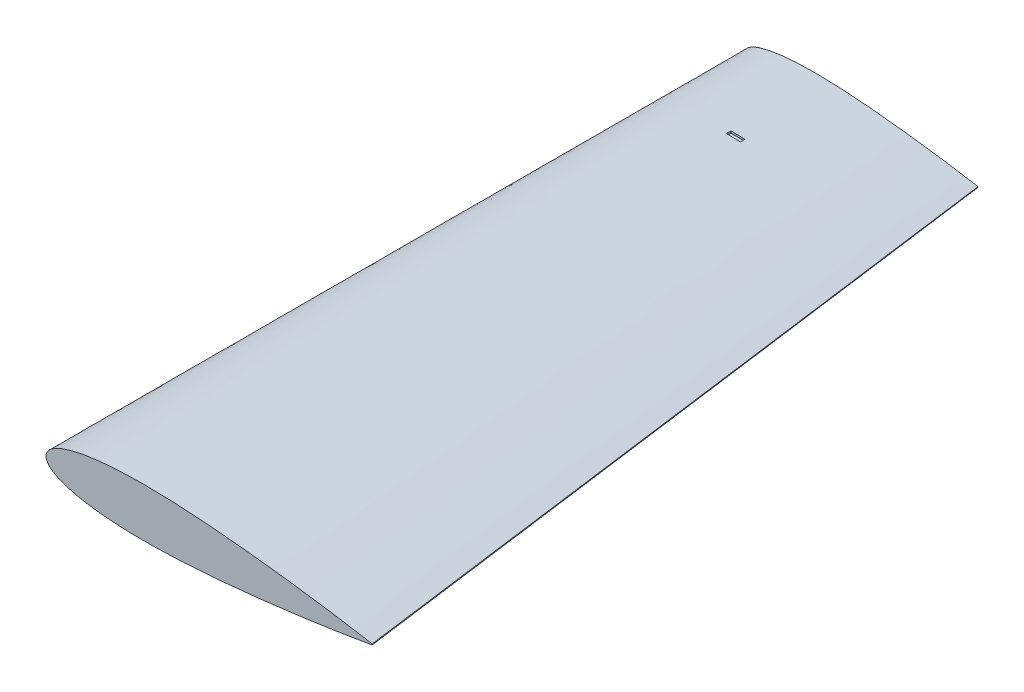
ISO-10303-21;
HEADER;
FILE_DESCRIPTION(('STEP AP214'),'2;1');
FILE_NAME('part.step','',(''),(''),'','','');
FILE_SCHEMA(('AUTOMOTIVE_DESIGN { 1 0 10303 214 1 1 1 1 }'));
ENDSEC;
DATA;
#1=APPLICATION_CONTEXT('core data for automotive mechanical design processes');
#2=APPLICATION_PROTOCOL_DEFINITION('international standard','automotive_design',2000,#1);
#3=PRODUCT_CONTEXT('',#1,'mechanical');
#4=PRODUCT('Part','Part','',(#3));
#5=PRODUCT_RELATED_PRODUCT_CATEGORY('part','',(#4));
#6=PRODUCT_DEFINITION_FORMATION('','',#4);
#7=PRODUCT_DEFINITION_CONTEXT('part definition',#1,'design');
#8=PRODUCT_DEFINITION('design','',#6,#7);
#9=PRODUCT_DEFINITION_SHAPE('','',#8);
#10=(LENGTH_UNIT() NAMED_UNIT(*) SI_UNIT(.MILLI.,.METRE.));
#11=(NAMED_UNIT(*) PLANE_ANGLE_UNIT() SI_UNIT($,.RADIAN.));
#12=(NAMED_UNIT(*) SI_UNIT($,.STERADIAN.) SOLID_ANGLE_UNIT());
#13=UNCERTAINTY_MEASURE_WITH_UNIT(LENGTH_MEASURE(1.E-05),#10,'distance_accuracy_value','');
#14=(GEOMETRIC_REPRESENTATION_CONTEXT(3) GLOBAL_UNCERTAINTY_ASSIGNED_CONTEXT((#13)) GLOBAL_UNIT_ASSIGNED_CONTEXT((#10,
#11,#12)) REPRESENTATION_CONTEXT('',''));
#15=CARTESIAN_POINT('',(0.,0.,0.));
#16=DIRECTION('',(0.,0.,1.));
#17=DIRECTION('',(1.,0.,0.));
#18=AXIS2_PLACEMENT_3D('',#15,#16,#17);
#19=CARTESIAN_POINT('',(70.,-0.1106,150.));
#20=CARTESIAN_POINT('',(50.,-0.079,0.));
#21=CARTESIAN_POINT('',(68.8337197653923,-0.311248034243055,150.));
#22=CARTESIAN_POINT('',(49.166942689566,-0.222320024459326,0.));
#23=CARTESIAN_POINT('',(66.5029583581218,-0.712234590287825,150.));
#24=CARTESIAN_POINT('',(47.5021131129441,-0.508738993062735,0.));
#25=CARTESIAN_POINT('',(61.8387019833579,-1.45769744476413,150.));
#26=CARTESIAN_POINT('',(44.1705014166842,-1.04121246054581,0.));
#27=CARTESIAN_POINT('',(56.0079453132405,-2.3134898362565,150.));
#28=CARTESIAN_POINT('',(40.0056752237432,-1.65249274018322,0.));
#29=CARTESIAN_POINT('',(49.0073591431766,-3.22523489764067,150.));
#30=CARTESIAN_POINT('',(35.0052565308404,-2.30373921260048,0.));
#31=CARTESIAN_POINT('',(42.007451256543,-4.01611555392026,150.));
#32=CARTESIAN_POINT('',(30.0053223261021,-2.86865396708589,0.));
#33=CARTESIAN_POINT('',(35.0074672180595,-4.66252154361423,150.));
#34=CARTESIAN_POINT('',(25.0053337271853,-3.33037253115302,0.));
#35=CARTESIAN_POINT('',(28.0063734198185,-5.12173570279508,150.));
#36=CARTESIAN_POINT('',(20.0045524427275,-3.65838264485363,0.));
#37=CARTESIAN_POINT('',(22.1673370094937,-5.28338672246203,150.));
#38=CARTESIAN_POINT('',(15.8338121496384,-3.77384765890145,0.));
#39=CARTESIAN_POINT('',(17.4980278952632,-5.21971676303903,150.));
#40=CARTESIAN_POINT('',(12.4985913537595,-3.72836911645645,0.));
#41=CARTESIAN_POINT('',(13.9941139705167,-5.04655717397942,150.));
#42=CARTESIAN_POINT('',(9.99579569322624,-3.60468369569959,0.));
#43=CARTESIAN_POINT('',(10.4853991903488,-4.71335698420051,150.));
#44=CARTESIAN_POINT('',(7.48957085024917,-3.36668356014322,0.));
#45=CARTESIAN_POINT('',(7.56429491491292,-4.24686419108419,150.));
#46=CARTESIAN_POINT('',(5.40306779636637,-3.03347442220299,0.));
#47=CARTESIAN_POINT('',(5.23141239456961,-3.69216703403844,150.));
#48=CARTESIAN_POINT('',(3.7367231389783,-2.63726216717032,0.));
#49=CARTESIAN_POINT('',(3.46012626155263,-3.13591504539705,150.));
#50=CARTESIAN_POINT('',(2.47151875825186,-2.23993931814074,0.));
#51=CARTESIAN_POINT('',(1.97102470716692,-2.46079902707417,150.));
#52=CARTESIAN_POINT('',(1.40787479083353,-1.75771359076727,0.));
#53=CARTESIAN_POINT('',(0.634330614674361,-1.56745643487817,150.));
#54=CARTESIAN_POINT('',(0.453093296195959,-1.11961173919868,0.));
#55=CARTESIAN_POINT('',(-0.402584956951755,0.,150.));
#56=CARTESIAN_POINT('',(-0.287560683536965,0.,0.));
#57=CARTESIAN_POINT('',(0.634330614674353,1.56745643487816,150.));
#58=CARTESIAN_POINT('',(0.453093296195967,1.11961173919869,0.));
#59=CARTESIAN_POINT('',(1.97102470716693,2.46079902707418,150.));
#60=CARTESIAN_POINT('',(1.40787479083352,1.75771359076727,0.));
#61=CARTESIAN_POINT('',(3.46012626155262,3.13591504539704,150.));
#62=CARTESIAN_POINT('',(2.47151875825187,2.23993931814074,0.));
#63=CARTESIAN_POINT('',(5.23141239456961,3.69216703403844,150.));
#64=CARTESIAN_POINT('',(3.7367231389783,2.63726216717032,0.));
#65=CARTESIAN_POINT('',(7.56429491491292,4.24686419108419,150.));
#66=CARTESIAN_POINT('',(5.40306779636637,3.03347442220299,0.));
#67=CARTESIAN_POINT('',(10.4853991903488,4.71335698420051,150.));
#68=CARTESIAN_POINT('',(7.48957085024917,3.36668356014322,0.));
#69=CARTESIAN_POINT('',(13.9941139705167,5.04655717397942,150.));
#70=CARTESIAN_POINT('',(9.99579569322624,3.60468369569959,0.));
#71=CARTESIAN_POINT('',(17.4980278952632,5.21971676303903,150.));
#72=CARTESIAN_POINT('',(12.4985913537595,3.72836911645645,0.));
#73=CARTESIAN_POINT('',(22.1673370094937,5.28338672246203,150.));
#74=CARTESIAN_POINT('',(15.8338121496384,3.77384765890145,0.));
#75=CARTESIAN_POINT('',(28.0063734198185,5.12173570279508,150.));
#76=CARTESIAN_POINT('',(20.0045524427275,3.65838264485363,0.));
#77=CARTESIAN_POINT('',(35.0074672180595,4.66252154361423,150.));
#78=CARTESIAN_POINT('',(25.0053337271853,3.33037253115302,0.));
#79=CARTESIAN_POINT('',(42.007451256543,4.01611555392026,150.));
#80=CARTESIAN_POINT('',(30.0053223261021,2.8686539670859,0.));
#81=CARTESIAN_POINT('',(49.0073591431766,3.22523489764067,150.));
#82=CARTESIAN_POINT('',(35.0052565308404,2.30373921260048,0.));
#83=CARTESIAN_POINT('',(56.0079453132405,2.3134898362565,150.));
#84=CARTESIAN_POINT('',(40.0056752237432,1.65249274018322,0.));
#85=CARTESIAN_POINT('',(61.8387019833579,1.45769744476413,150.));
#86=CARTESIAN_POINT('',(44.1705014166842,1.04121246054581,0.));
#87=CARTESIAN_POINT('',(66.5029583581218,0.712234590287827,150.));
#88=CARTESIAN_POINT('',(47.5021131129441,0.508738993062733,0.));
#89=CARTESIAN_POINT('',(68.8337197653923,0.311248034243056,150.));
#90=CARTESIAN_POINT('',(49.166942689566,0.222320024459325,0.));
#91=CARTESIAN_POINT('',(70.,0.1106,150.));
#92=CARTESIAN_POINT('',(50.,0.079,0.));
#93=B_SPLINE_SURFACE_WITH_KNOTS('',3,1,((#19,#20),(#21,#22),(#23,#24),(#25,#26),(#27,#28),(#29,
#30),(#31,#32),(#33,#34),(#35,#36),(#37,#38),(#39,#40),(#41,#42),(#43,#44),(#45,#46),(#47,#48),
(#49,#50),(#51,#52),(#53,#54),(#55,#56),(#57,#58),(#59,#60),(#61,#62),(#63,#64),(#65,#66),(#67,
#68),(#69,#70),(#71,#72),(#73,#74),(#75,#76),(#77,#78),(#79,#80),(#81,#82),(#83,#84),(#85,#86),
(#87,#88),(#89,#90),(#91,#92)),.UNSPECIFIED.,.F.,.F.,.F.,(4,1,1,1,1,1,1,1,1,1,1,1,1,1,1,1,1,1,1,
1,1,1,1,1,1,1,1,1,1,1,1,1,1,1,4),(2,2),(0.,0.0246840231451878,0.0493299696040298,
0.0985220811790584,0.147602022491555,0.196578275758491,0.245450479952565,0.294218900495614,
0.342903642198885,0.367241268256885,0.391607783764362,0.416059249203825,0.440726348791267,
0.453242725185227,0.466028386782603,0.479472724477829,0.486972137019317,0.5,0.513027862980683,
0.520527275522171,0.533971613217397,0.546757274814773,0.559273651208734,0.583940750796175,
0.608392216235638,0.632758731743115,0.657096357801115,0.705781099504386,0.754549520047436,
0.80342172424151,0.852397977508445,0.901477918820942,0.95067003039597,0.975315976854812,1.),(0.,
1.),.UNSPECIFIED.);
#94=CARTESIAN_POINT('',(17.,3.9435409575129,20.));
#95=CARTESIAN_POINT('',(17.,3.94704137872079,20.3333333333333));
#96=CARTESIAN_POINT('',(17.,3.95054179992868,20.6666666666667));
#97=CARTESIAN_POINT('',(17.,3.95404222113656,21.));
#98=B_SPLINE_CURVE_WITH_KNOTS('',3,(#94,#95,#96,#97),.UNSPECIFIED.,.F.,.F.,(4,4),(0.,
1.00005513674883),.UNSPECIFIED.);
#99=CARTESIAN_POINT('',(17.,3.9435409575129,20.));
#100=VERTEX_POINT('',#99);
#101=CARTESIAN_POINT('',(17.,3.95404222113656,21.));
#102=VERTEX_POINT('',#101);
#103=EDGE_CURVE('E247',#100,#102,#98,.T.);
#104=CARTESIAN_POINT('',(17.,3.9435409575129,20.));
#105=CARTESIAN_POINT('',(17.1667204017985,3.94150104054949,20.));
#106=CARTESIAN_POINT('',(17.3334357160651,3.93905635182317,20.));
#107=CARTESIAN_POINT('',(17.6668464236727,3.93338366271605,20.));
#108=CARTESIAN_POINT('',(17.8335418175413,3.93015569340708,20.));
#109=CARTESIAN_POINT('',(18.1669131117673,3.92294257508684,20.));
#110=CARTESIAN_POINT('',(18.3335890124256,3.91895743994164,20.));
#111=CARTESIAN_POINT('',(18.6669213943416,3.91025606132175,20.));
#112=CARTESIAN_POINT('',(18.8335778756341,3.90553981918184,20.));
#113=CARTESIAN_POINT('',(19.1668726976998,3.89540220446001,20.));
#114=CARTESIAN_POINT('',(19.33351103804,3.88998081768048,20.));
#115=CARTESIAN_POINT('',(19.6667704896104,3.87845882619122,20.));
#116=CARTESIAN_POINT('',(19.8333915999637,3.8723581960986,20.));
#117=CARTESIAN_POINT('',(20.,3.86593106788961,20.));
#118=B_SPLINE_CURVE_WITH_KNOTS('',3,(#104,#105,#106,#107,#108,#109,#110,#111,#112,#113,#114,
#115,#116,#117),.UNSPECIFIED.,.F.,.F.,(4,2,2,2,2,2,4),(0.,0.500197954692799,1.00037607035388,
1.5005450270703,2.00071307063195,2.50089118628277,3.00108799954232),.UNSPECIFIED.);
#119=CARTESIAN_POINT('',(20.,3.86593106788961,20.));
#120=VERTEX_POINT('',#119);
#121=EDGE_CURVE('E255',#100,#120,#118,.T.);
#122=CARTESIAN_POINT('',(20.,3.86593106788961,20.));
#123=CARTESIAN_POINT('',(20.,3.86984118178841,20.3333333333333));
#124=CARTESIAN_POINT('',(20.,3.87375129568721,20.6666666666667));
#125=CARTESIAN_POINT('',(20.,3.87766140958602,21.));
#126=B_SPLINE_CURVE_WITH_KNOTS('',3,(#122,#123,#124,#125),.UNSPECIFIED.,.F.,.F.,(4,4),(0.,
1.00006879809158),.UNSPECIFIED.);
#127=CARTESIAN_POINT('',(20.,3.87766140958602,21.));
#128=VERTEX_POINT('',#127);
#129=EDGE_CURVE('E219',#120,#128,#126,.T.);
#130=CARTESIAN_POINT('',(17.,3.95404222113656,21.));
#131=CARTESIAN_POINT('',(17.1667195013024,3.9520719049104,21.));
#132=CARTESIAN_POINT('',(17.3334340836188,3.9496967291327,21.));
#133=CARTESIAN_POINT('',(17.6668436388927,3.94416275567023,21.));
#134=CARTESIAN_POINT('',(17.8335386123662,3.94100398911252,21.));
#135=CARTESIAN_POINT('',(18.1669093644109,3.93392883554415,21.));
#136=CARTESIAN_POINT('',(18.3335851432781,3.93001246243342,21.));
#137=CARTESIAN_POINT('',(18.6669175687473,3.92144803713468,21.));
#138=CARTESIAN_POINT('',(18.8335742153834,3.91679998627689,21.));
#139=CARTESIAN_POINT('',(19.1668696387606,3.90679805435143,21.));
#140=CARTESIAN_POINT('',(19.3335084150736,3.90144415905343,21.));
#141=CARTESIAN_POINT('',(19.6667689943242,3.89005632208551,21.));
#142=CARTESIAN_POINT('',(19.8333907963927,3.88402235495781,21.));
#143=CARTESIAN_POINT('',(20.,3.87766140958602,21.));
#144=B_SPLINE_CURVE_WITH_KNOTS('',3,(#130,#131,#132,#133,#134,#135,#136,#137,#138,#139,#140,
#141,#142,#143),.UNSPECIFIED.,.F.,.F.,(4,2,2,2,2,2,4),(0.,0.500192743048995,1.00036561980896,
1.50052932068075,2.00069211224797,2.5008649889978,3.00105659542707),.UNSPECIFIED.);
#145=EDGE_CURVE('E211',#102,#128,#144,.T.);
#146=CARTESIAN_POINT('',(70.,0.1106,150.));
#147=CARTESIAN_POINT('',(68.8337197653923,0.311248034243056,150.));
#148=CARTESIAN_POINT('',(66.5029583581218,0.712234590287827,150.));
#149=CARTESIAN_POINT('',(61.8387019833579,1.45769744476413,150.));
#150=CARTESIAN_POINT('',(56.0079453132405,2.3134898362565,150.));
#151=CARTESIAN_POINT('',(49.0073591431766,3.22523489764067,150.));
#152=CARTESIAN_POINT('',(42.007451256543,4.01611555392026,150.));
#153=CARTESIAN_POINT('',(35.0074672180595,4.66252154361423,150.));
#154=CARTESIAN_POINT('',(28.0063734198185,5.12173570279508,150.));
#155=CARTESIAN_POINT('',(22.1673370094937,5.28338672246203,150.));
#156=CARTESIAN_POINT('',(17.4980278952632,5.21971676303903,150.));
#157=CARTESIAN_POINT('',(13.9941139705167,5.04655717397942,150.));
#158=CARTESIAN_POINT('',(10.4853991903488,4.71335698420051,150.));
#159=CARTESIAN_POINT('',(7.56429491491292,4.24686419108419,150.));
#160=CARTESIAN_POINT('',(5.23141239456961,3.69216703403844,150.));
#161=CARTESIAN_POINT('',(3.46012626155262,3.13591504539704,150.));
#162=CARTESIAN_POINT('',(1.97102470716693,2.46079902707418,150.));
#163=CARTESIAN_POINT('',(0.634330614674353,1.56745643487816,150.));
#164=CARTESIAN_POINT('',(-0.402584956951755,0.,150.));
#165=CARTESIAN_POINT('',(0.634330614674361,-1.56745643487817,150.));
#166=CARTESIAN_POINT('',(1.97102470716692,-2.46079902707417,150.));
#167=CARTESIAN_POINT('',(3.46012626155263,-3.13591504539705,150.));
#168=CARTESIAN_POINT('',(5.23141239456961,-3.69216703403844,150.));
#169=CARTESIAN_POINT('',(7.56429491491292,-4.24686419108419,150.));
#170=CARTESIAN_POINT('',(10.4853991903488,-4.71335698420051,150.));
#171=CARTESIAN_POINT('',(13.9941139705167,-5.04655717397942,150.));
#172=CARTESIAN_POINT('',(17.4980278952632,-5.21971676303903,150.));
#173=CARTESIAN_POINT('',(22.1673370094937,-5.28338672246203,150.));
#174=CARTESIAN_POINT('',(28.0063734198185,-5.12173570279508,150.));
#175=CARTESIAN_POINT('',(35.0074672180595,-4.66252154361423,150.));
#176=CARTESIAN_POINT('',(42.007451256543,-4.01611555392026,150.));
#177=CARTESIAN_POINT('',(49.0073591431766,-3.22523489764067,150.));
#178=CARTESIAN_POINT('',(56.0079453132405,-2.3134898362565,150.));
#179=CARTESIAN_POINT('',(61.8387019833579,-1.45769744476413,150.));
#180=CARTESIAN_POINT('',(66.5029583581218,-0.712234590287825,150.));
#181=CARTESIAN_POINT('',(68.8337197653923,-0.311248034243055,150.));
#182=CARTESIAN_POINT('',(70.,-0.1106,150.));
#183=B_SPLINE_CURVE_WITH_KNOTS('',3,(#146,#147,#148,#149,#150,#151,#152,#153,#154,#155,#156,
#157,#158,#159,#160,#161,#162,#163,#164,#165,#166,#167,#168,#169,#170,#171,#172,#173,#174,#175,
#176,#177,#178,#179,#180,#181,#182),.UNSPECIFIED.,.F.,.F.,(4,1,1,1,1,1,1,1,1,1,1,1,1,1,1,1,1,1,
1,1,1,1,1,1,1,1,1,1,1,1,1,1,1,1,4),(0.,0.0246840231451877,0.0493299696040297,0.0985220811790582,
0.147602022491555,0.19657827575849,0.245450479952564,0.294218900495614,0.342903642198885,
0.367241268256885,0.391607783764362,0.416059249203825,0.440726348791267,0.453242725185227,
0.466028386782603,0.479472724477829,0.486972137019317,0.5,0.513027862980683,0.520527275522171,
0.533971613217397,0.546757274814773,0.559273651208733,0.583940750796175,0.608392216235638,
0.632758731743115,0.657096357801115,0.705781099504386,0.754549520047435,0.803421724241509,
0.852397977508445,0.901477918820942,0.95067003039597,0.975315976854812,1.),.UNSPECIFIED.);
#184=CARTESIAN_POINT('',(70.,0.1106,150.));
#185=VERTEX_POINT('',#184);
#186=CARTESIAN_POINT('',(70.,-0.1106,150.));
#187=VERTEX_POINT('',#186);
#188=EDGE_CURVE('E170',#185,#187,#183,.T.);
#189=DIRECTION('',(-0.132163717209503,-0.000208818673191014,-0.99122787907127));
#190=VECTOR('',#189,1.);
#191=CARTESIAN_POINT('',(70.,0.1106,150.));
#192=LINE('',#191,#190);
#193=CARTESIAN_POINT('',(50.,0.079,0.));
#194=VERTEX_POINT('',#193);
#195=EDGE_CURVE('E193',#185,#194,#192,.T.);
#196=CARTESIAN_POINT('',(50.,0.079,0.));
#197=CARTESIAN_POINT('',(49.166942689566,0.222320024459325,0.));
#198=CARTESIAN_POINT('',(47.5021131129441,0.508738993062733,0.));
#199=CARTESIAN_POINT('',(44.1705014166842,1.04121246054581,0.));
#200=CARTESIAN_POINT('',(40.0056752237432,1.65249274018322,0.));
#201=CARTESIAN_POINT('',(35.0052565308404,2.30373921260048,0.));
#202=CARTESIAN_POINT('',(30.0053223261021,2.8686539670859,0.));
#203=CARTESIAN_POINT('',(25.0053337271853,3.33037253115302,0.));
#204=CARTESIAN_POINT('',(20.0045524427275,3.65838264485363,0.));
#205=CARTESIAN_POINT('',(15.8338121496384,3.77384765890145,0.));
#206=CARTESIAN_POINT('',(12.4985913537595,3.72836911645645,0.));
#207=CARTESIAN_POINT('',(9.99579569322624,3.60468369569959,0.));
#208=CARTESIAN_POINT('',(7.48957085024917,3.36668356014322,0.));
#209=CARTESIAN_POINT('',(5.40306779636637,3.03347442220299,0.));
#210=CARTESIAN_POINT('',(3.7367231389783,2.63726216717032,0.));
#211=CARTESIAN_POINT('',(2.47151875825187,2.23993931814074,0.));
#212=CARTESIAN_POINT('',(1.40787479083352,1.75771359076727,0.));
#213=CARTESIAN_POINT('',(0.453093296195967,1.11961173919869,0.));
#214=CARTESIAN_POINT('',(-0.287560683536965,0.,0.));
#215=CARTESIAN_POINT('',(0.453093296195959,-1.11961173919868,0.));
#216=CARTESIAN_POINT('',(1.40787479083353,-1.75771359076727,0.));
#217=CARTESIAN_POINT('',(2.47151875825186,-2.23993931814074,0.));
#218=CARTESIAN_POINT('',(3.7367231389783,-2.63726216717032,0.));
#219=CARTESIAN_POINT('',(5.40306779636637,-3.03347442220299,0.));
#220=CARTESIAN_POINT('',(7.48957085024917,-3.36668356014322,0.));
#221=CARTESIAN_POINT('',(9.99579569322624,-3.60468369569959,0.));
#222=CARTESIAN_POINT('',(12.4985913537595,-3.72836911645645,0.));
#223=CARTESIAN_POINT('',(15.8338121496384,-3.77384765890145,0.));
#224=CARTESIAN_POINT('',(20.0045524427275,-3.65838264485363,0.));
#225=CARTESIAN_POINT('',(25.0053337271853,-3.33037253115302,0.));
#226=CARTESIAN_POINT('',(30.0053223261021,-2.86865396708589,0.));
#227=CARTESIAN_POINT('',(35.0052565308404,-2.30373921260048,0.));
#228=CARTESIAN_POINT('',(40.0056752237432,-1.65249274018322,0.));
#229=CARTESIAN_POINT('',(44.1705014166842,-1.04121246054581,0.));
#230=CARTESIAN_POINT('',(47.5021131129441,-0.508738993062735,0.));
#231=CARTESIAN_POINT('',(49.166942689566,-0.222320024459326,0.));
#232=CARTESIAN_POINT('',(50.,-0.079,0.));
#233=B_SPLINE_CURVE_WITH_KNOTS('',3,(#196,#197,#198,#199,#200,#201,#202,#203,#204,#205,#206,
#207,#208,#209,#210,#211,#212,#213,#214,#215,#216,#217,#218,#219,#220,#221,#222,#223,#224,#225,
#226,#227,#228,#229,#230,#231,#232),.UNSPECIFIED.,.F.,.F.,(4,1,1,1,1,1,1,1,1,1,1,1,1,1,1,1,1,1,
1,1,1,1,1,1,1,1,1,1,1,1,1,1,1,1,4),(0.,0.0246840231451877,0.0493299696040297,0.0985220811790582,
0.147602022491555,0.19657827575849,0.245450479952564,0.294218900495614,0.342903642198885,
0.367241268256885,0.391607783764362,0.416059249203825,0.440726348791267,0.453242725185227,
0.466028386782603,0.479472724477829,0.486972137019317,0.5,0.513027862980683,0.520527275522171,
0.533971613217397,0.546757274814773,0.559273651208733,0.583940750796175,0.608392216235638,
0.632758731743115,0.657096357801115,0.705781099504386,0.754549520047436,0.803421724241509,
0.852397977508445,0.901477918820942,0.95067003039597,0.975315976854812,1.),.UNSPECIFIED.);
#234=CARTESIAN_POINT('',(50.,-0.079,0.));
#235=VERTEX_POINT('',#234);
#236=EDGE_CURVE('E196',#194,#235,#233,.T.);
#237=DIRECTION('',(-0.132163717209503,0.000208818673191014,-0.99122787907127));
#238=VECTOR('',#237,1.);
#239=CARTESIAN_POINT('',(70.,-0.1106,150.));
#240=LINE('',#239,#238);
#241=EDGE_CURVE('E192',#187,#235,#240,.T.);
#242=CARTESIAN_POINT('',(17.,-3.9435409575129,20.));
#243=CARTESIAN_POINT('',(17.1667204017985,-3.94150104054949,20.));
#244=CARTESIAN_POINT('',(17.3334357160651,-3.93905635182317,20.));
#245=CARTESIAN_POINT('',(17.6668464236726,-3.93338366271605,20.));
#246=CARTESIAN_POINT('',(17.8335418175413,-3.93015569340708,20.));
#247=CARTESIAN_POINT('',(18.1669131117673,-3.92294257508684,20.));
#248=CARTESIAN_POINT('',(18.3335890124256,-3.91895743994164,20.));
#249=CARTESIAN_POINT('',(18.6669213943416,-3.91025606132175,20.));
#250=CARTESIAN_POINT('',(18.8335778756341,-3.90553981918184,20.));
#251=CARTESIAN_POINT('',(19.1668726976998,-3.89540220446,20.));
#252=CARTESIAN_POINT('',(19.33351103804,-3.88998081768048,20.));
#253=CARTESIAN_POINT('',(19.6667704896104,-3.87845882619122,20.));
#254=CARTESIAN_POINT('',(19.8333915999637,-3.8723581960986,20.));
#255=CARTESIAN_POINT('',(20.,-3.86593106788961,20.));
#256=B_SPLINE_CURVE_WITH_KNOTS('',3,(#242,#243,#244,#245,#246,#247,#248,#249,#250,#251,#252,
#253,#254,#255),.UNSPECIFIED.,.F.,.F.,(4,2,2,2,2,2,4),(0.,0.500197954692799,1.00037607035388,
1.5005450270703,2.00071307063195,2.50089118628277,3.00108799954232),.UNSPECIFIED.);
#257=CARTESIAN_POINT('',(17.,-3.9435409575129,20.));
#258=VERTEX_POINT('',#257);
#259=CARTESIAN_POINT('',(20.,-3.86593106788961,20.));
#260=VERTEX_POINT('',#259);
#261=EDGE_CURVE('E254',#258,#260,#256,.T.);
#262=CARTESIAN_POINT('',(17.,-3.9435409575129,20.));
#263=CARTESIAN_POINT('',(17.,-3.94704137872079,20.3333333333333));
#264=CARTESIAN_POINT('',(17.,-3.95054179992867,20.6666666666667));
#265=CARTESIAN_POINT('',(17.,-3.95404222113656,21.));
#266=B_SPLINE_CURVE_WITH_KNOTS('',3,(#262,#263,#264,#265),.UNSPECIFIED.,.F.,.F.,(4,4),(0.,
1.00005513674882),.UNSPECIFIED.);
#267=CARTESIAN_POINT('',(17.,-3.95404222113656,21.));
#268=VERTEX_POINT('',#267);
#269=EDGE_CURVE('E11',#258,#268,#266,.T.);
#270=CARTESIAN_POINT('',(17.,-3.95404222113656,21.));
#271=CARTESIAN_POINT('',(17.1667195013024,-3.9520719049104,21.));
#272=CARTESIAN_POINT('',(17.3334340836188,-3.9496967291327,21.));
#273=CARTESIAN_POINT('',(17.6668436388927,-3.94416275567023,21.));
#274=CARTESIAN_POINT('',(17.8335386123662,-3.94100398911252,21.));
#275=CARTESIAN_POINT('',(18.1669093644109,-3.93392883554414,21.));
#276=CARTESIAN_POINT('',(18.3335851432781,-3.93001246243341,21.));
#277=CARTESIAN_POINT('',(18.6669175687473,-3.92144803713468,21.));
#278=CARTESIAN_POINT('',(18.8335742153834,-3.91679998627689,21.));
#279=CARTESIAN_POINT('',(19.1668696387606,-3.90679805435143,21.));
#280=CARTESIAN_POINT('',(19.3335084150736,-3.90144415905343,21.));
#281=CARTESIAN_POINT('',(19.6667689943242,-3.89005632208551,21.));
#282=CARTESIAN_POINT('',(19.8333907963927,-3.88402235495781,21.));
#283=CARTESIAN_POINT('',(20.,-3.87766140958602,21.));
#284=B_SPLINE_CURVE_WITH_KNOTS('',3,(#270,#271,#272,#273,#274,#275,#276,#277,#278,#279,#280,
#281,#282,#283),.UNSPECIFIED.,.F.,.F.,(4,2,2,2,2,2,4),(0.,0.500192743048992,1.00036561980895,
1.50052932068075,2.00069211224796,2.50086498899779,3.00105659542706),.UNSPECIFIED.);
#285=CARTESIAN_POINT('',(20.,-3.87766140958602,21.));
#286=VERTEX_POINT('',#285);
#287=EDGE_CURVE('E54',#268,#286,#284,.T.);
#288=CARTESIAN_POINT('',(20.,-3.86593106788961,20.));
#289=CARTESIAN_POINT('',(20.,-3.86984118178841,20.3333333333333));
#290=CARTESIAN_POINT('',(20.,-3.87375129568721,20.6666666666667));
#291=CARTESIAN_POINT('',(20.,-3.87766140958602,21.));
#292=B_SPLINE_CURVE_WITH_KNOTS('',3,(#288,#289,#290,#291),.UNSPECIFIED.,.F.,.F.,(4,4),(0.,
1.00006879809158),.UNSPECIFIED.);
#293=EDGE_CURVE('E267',#260,#286,#292,.T.);
#294=ORIENTED_EDGE('',*,*,#103,.F.);
#295=ORIENTED_EDGE('',*,*,#121,.T.);
#296=ORIENTED_EDGE('',*,*,#129,.T.);
#297=ORIENTED_EDGE('',*,*,#145,.F.);
#298=EDGE_LOOP('',(#294,#295,#296,#297));
#299=FACE_BOUND('',#298,.T.);
#300=ORIENTED_EDGE('',*,*,#188,.F.);
#301=ORIENTED_EDGE('',*,*,#195,.T.);
#302=ORIENTED_EDGE('',*,*,#236,.T.);
#303=ORIENTED_EDGE('',*,*,#241,.F.);
#304=EDGE_LOOP('',(#300,#301,#302,#303));
#305=FACE_BOUND('',#304,.T.);
#306=ORIENTED_EDGE('',*,*,#261,.F.);
#307=ORIENTED_EDGE('',*,*,#269,.T.);
#308=ORIENTED_EDGE('',*,*,#287,.T.);
#309=ORIENTED_EDGE('',*,*,#293,.F.);
#310=EDGE_LOOP('',(#306,#307,#308,#309));
#311=FACE_BOUND('',#310,.T.);
#312=ADVANCED_FACE('F40',(#299,#305,#311),#93,.T.);
#313=CARTESIAN_POINT('',(0.,0.,0.));
#314=DIRECTION('',(0.,0.,-1.));
#315=DIRECTION('',(-1.,0.,0.));
#316=AXIS2_PLACEMENT_3D('',#313,#314,#315);
#317=PLANE('',#316);
#318=ORIENTED_EDGE('',*,*,#236,.F.);
#319=DIRECTION('',(0.,1.,0.));
#320=VECTOR('',#319,1.);
#321=CARTESIAN_POINT('',(50.,0.079,0.));
#322=LINE('',#321,#320);
#323=EDGE_CURVE('E204',#235,#194,#322,.T.);
#324=ORIENTED_EDGE('',*,*,#323,.F.);
#325=EDGE_LOOP('',(#318,#324));
#326=FACE_BOUND('',#325,.T.);
#327=ADVANCED_FACE('F42',(#326),#317,.T.);
#328=CARTESIAN_POINT('',(0.,0.,150.));
#329=DIRECTION('',(0.,0.,-1.));
#330=DIRECTION('',(-1.,0.,0.));
#331=AXIS2_PLACEMENT_3D('',#328,#329,#330);
#332=PLANE('',#331);
#333=ORIENTED_EDGE('',*,*,#188,.T.);
#334=DIRECTION('',(0.,1.,0.));
#335=VECTOR('',#334,1.);
#336=CARTESIAN_POINT('',(70.,0.1106,150.));
#337=LINE('',#336,#335);
#338=EDGE_CURVE('E186',#187,#185,#337,.T.);
#339=ORIENTED_EDGE('',*,*,#338,.T.);
#340=EDGE_LOOP('',(#333,#339));
#341=FACE_BOUND('',#340,.T.);
#342=ADVANCED_FACE('F245',(#341),#332,.F.);
#343=CARTESIAN_POINT('',(49.1266375545852,-2.15749699903146E-12,-6.55021834061136));
#344=DIRECTION('',(0.991227900682635,0.,-0.132163720091018));
#345=DIRECTION('',(-0.132163720091018,0.,-0.991227900682635));
#346=AXIS2_PLACEMENT_3D('',#343,#344,#345);
#347=PLANE('',#346);
#348=ORIENTED_EDGE('',*,*,#241,.T.);
#349=ORIENTED_EDGE('',*,*,#323,.T.);
#350=ORIENTED_EDGE('',*,*,#195,.F.);
#351=ORIENTED_EDGE('',*,*,#338,.F.);
#352=EDGE_LOOP('',(#348,#349,#350,#351));
#353=FACE_BOUND('',#352,.T.);
#354=ADVANCED_FACE('F243',(#353),#347,.T.);
#355=CARTESIAN_POINT('',(17.,3.5,20.));
#356=DIRECTION('',(-1.,0.,0.));
#357=DIRECTION('',(0.,0.,1.));
#358=AXIS2_PLACEMENT_3D('',#355,#356,#357);
#359=PLANE('',#358);
#360=ORIENTED_EDGE('',*,*,#103,.T.);
#361=DIRECTION('',(0.,1.,0.));
#362=VECTOR('',#361,1.);
#363=CARTESIAN_POINT('',(17.,3.5,21.));
#364=LINE('',#363,#362);
#365=CARTESIAN_POINT('',(17.,3.5,21.));
#366=VERTEX_POINT('',#365);
#367=EDGE_CURVE('E69',#366,#102,#364,.T.);
#368=ORIENTED_EDGE('',*,*,#367,.F.);
#369=DIRECTION('',(0.,0.,1.));
#370=VECTOR('',#369,1.);
#371=CARTESIAN_POINT('',(17.,3.5,20.));
#372=LINE('',#371,#370);
#373=CARTESIAN_POINT('',(17.,3.5,20.));
#374=VERTEX_POINT('',#373);
#375=EDGE_CURVE('E145',#374,#366,#372,.T.);
#376=ORIENTED_EDGE('',*,*,#375,.F.);
#377=DIRECTION('',(0.,1.,0.));
#378=VECTOR('',#377,1.);
#379=CARTESIAN_POINT('',(17.,3.5,20.));
#380=LINE('',#379,#378);
#381=EDGE_CURVE('E166',#374,#100,#380,.T.);
#382=ORIENTED_EDGE('',*,*,#381,.T.);
#383=EDGE_LOOP('',(#360,#368,#376,#382));
#384=FACE_BOUND('',#383,.T.);
#385=ADVANCED_FACE('F238',(#384),#359,.F.);
#386=CARTESIAN_POINT('',(17.,3.5,20.));
#387=DIRECTION('',(0.,0.,1.));
#388=DIRECTION('',(1.,0.,0.));
#389=AXIS2_PLACEMENT_3D('',#386,#387,#388);
#390=PLANE('',#389);
#391=ORIENTED_EDGE('',*,*,#381,.F.);
#392=DIRECTION('',(1.,0.,0.));
#393=VECTOR('',#392,1.);
#394=CARTESIAN_POINT('',(17.,3.5,20.));
#395=LINE('',#394,#393);
#396=CARTESIAN_POINT('',(20.,3.5,20.));
#397=VERTEX_POINT('',#396);
#398=EDGE_CURVE('E163',#374,#397,#395,.T.);
#399=ORIENTED_EDGE('',*,*,#398,.T.);
#400=DIRECTION('',(0.,1.,0.));
#401=VECTOR('',#400,1.);
#402=CARTESIAN_POINT('',(20.,3.5,20.));
#403=LINE('',#402,#401);
#404=EDGE_CURVE('E171',#397,#120,#403,.T.);
#405=ORIENTED_EDGE('',*,*,#404,.T.);
#406=ORIENTED_EDGE('',*,*,#121,.F.);
#407=EDGE_LOOP('',(#391,#399,#405,#406));
#408=FACE_BOUND('',#407,.T.);
#409=ADVANCED_FACE('F242',(#408),#390,.T.);
#410=CARTESIAN_POINT('',(20.,3.5,20.));
#411=DIRECTION('',(-1.,0.,0.));
#412=DIRECTION('',(0.,0.,1.));
#413=AXIS2_PLACEMENT_3D('',#410,#411,#412);
#414=PLANE('',#413);
#415=ORIENTED_EDGE('',*,*,#404,.F.);
#416=DIRECTION('',(0.,0.,1.));
#417=VECTOR('',#416,1.);
#418=CARTESIAN_POINT('',(20.,3.5,20.));
#419=LINE('',#418,#417);
#420=CARTESIAN_POINT('',(20.,3.5,21.));
#421=VERTEX_POINT('',#420);
#422=EDGE_CURVE('E160',#397,#421,#419,.T.);
#423=ORIENTED_EDGE('',*,*,#422,.T.);
#424=DIRECTION('',(0.,1.,0.));
#425=VECTOR('',#424,1.);
#426=CARTESIAN_POINT('',(20.,3.5,21.));
#427=LINE('',#426,#425);
#428=EDGE_CURVE('E175',#421,#128,#427,.T.);
#429=ORIENTED_EDGE('',*,*,#428,.T.);
#430=ORIENTED_EDGE('',*,*,#129,.F.);
#431=EDGE_LOOP('',(#415,#423,#429,#430));
#432=FACE_BOUND('',#431,.T.);
#433=ADVANCED_FACE('F235',(#432),#414,.T.);
#434=CARTESIAN_POINT('',(17.,3.5,21.));
#435=DIRECTION('',(0.,0.,1.));
#436=DIRECTION('',(1.,0.,0.));
#437=AXIS2_PLACEMENT_3D('',#434,#435,#436);
#438=PLANE('',#437);
#439=ORIENTED_EDGE('',*,*,#145,.T.);
#440=ORIENTED_EDGE('',*,*,#428,.F.);
#441=DIRECTION('',(1.,0.,0.));
#442=VECTOR('',#441,1.);
#443=CARTESIAN_POINT('',(17.,3.5,21.));
#444=LINE('',#443,#442);
#445=EDGE_CURVE('E151',#366,#421,#444,.T.);
#446=ORIENTED_EDGE('',*,*,#445,.F.);
#447=ORIENTED_EDGE('',*,*,#367,.T.);
#448=EDGE_LOOP('',(#439,#440,#446,#447));
#449=FACE_BOUND('',#448,.T.);
#450=ADVANCED_FACE('F230',(#449),#438,.F.);
#451=CARTESIAN_POINT('',(0.,3.5,0.));
#452=DIRECTION('',(0.,1.,0.));
#453=DIRECTION('',(0.,0.,1.));
#454=AXIS2_PLACEMENT_3D('',#451,#452,#453);
#455=PLANE('',#454);
#456=ORIENTED_EDGE('',*,*,#375,.T.);
#457=ORIENTED_EDGE('',*,*,#445,.T.);
#458=ORIENTED_EDGE('',*,*,#422,.F.);
#459=ORIENTED_EDGE('',*,*,#398,.F.);
#460=EDGE_LOOP('',(#456,#457,#458,#459));
#461=FACE_BOUND('',#460,.T.);
#462=ADVANCED_FACE('F234',(#461),#455,.T.);
#463=CARTESIAN_POINT('',(17.,-3.5,20.));
#464=DIRECTION('',(1.,0.,0.));
#465=DIRECTION('',(0.,0.,-1.));
#466=AXIS2_PLACEMENT_3D('',#463,#464,#465);
#467=PLANE('',#466);
#468=DIRECTION('',(0.,-1.,0.));
#469=VECTOR('',#468,1.);
#470=CARTESIAN_POINT('',(17.,-3.5,20.));
#471=LINE('',#470,#469);
#472=CARTESIAN_POINT('',(17.,-3.5,20.));
#473=VERTEX_POINT('',#472);
#474=EDGE_CURVE('E61',#473,#258,#471,.T.);
#475=ORIENTED_EDGE('',*,*,#474,.F.);
#476=DIRECTION('',(0.,0.,1.));
#477=VECTOR('',#476,1.);
#478=CARTESIAN_POINT('',(17.,-3.5,20.));
#479=LINE('',#478,#477);
#480=CARTESIAN_POINT('',(17.,-3.5,21.));
#481=VERTEX_POINT('',#480);
#482=EDGE_CURVE('E127',#473,#481,#479,.T.);
#483=ORIENTED_EDGE('',*,*,#482,.T.);
#484=DIRECTION('',(0.,-1.,0.));
#485=VECTOR('',#484,1.);
#486=CARTESIAN_POINT('',(17.,-3.5,21.));
#487=LINE('',#486,#485);
#488=EDGE_CURVE('E139',#481,#268,#487,.T.);
#489=ORIENTED_EDGE('',*,*,#488,.T.);
#490=ORIENTED_EDGE('',*,*,#269,.F.);
#491=EDGE_LOOP('',(#475,#483,#489,#490));
#492=FACE_BOUND('',#491,.T.);
#493=ADVANCED_FACE('F138',(#492),#467,.T.);
#494=CARTESIAN_POINT('',(17.,-3.5,21.));
#495=DIRECTION('',(0.,0.,-1.));
#496=DIRECTION('',(-1.,0.,0.));
#497=AXIS2_PLACEMENT_3D('',#494,#495,#496);
#498=PLANE('',#497);
#499=ORIENTED_EDGE('',*,*,#488,.F.);
#500=DIRECTION('',(1.,0.,0.));
#501=VECTOR('',#500,1.);
#502=CARTESIAN_POINT('',(17.,-3.5,21.));
#503=LINE('',#502,#501);
#504=CARTESIAN_POINT('',(20.,-3.5,21.));
#505=VERTEX_POINT('',#504);
#506=EDGE_CURVE('E123',#481,#505,#503,.T.);
#507=ORIENTED_EDGE('',*,*,#506,.T.);
#508=DIRECTION('',(0.,-1.,0.));
#509=VECTOR('',#508,1.);
#510=CARTESIAN_POINT('',(20.,-3.5,21.));
#511=LINE('',#510,#509);
#512=EDGE_CURVE('E146',#505,#286,#511,.T.);
#513=ORIENTED_EDGE('',*,*,#512,.T.);
#514=ORIENTED_EDGE('',*,*,#287,.F.);
#515=EDGE_LOOP('',(#499,#507,#513,#514));
#516=FACE_BOUND('',#515,.T.);
#517=ADVANCED_FACE('F142',(#516),#498,.T.);
#518=CARTESIAN_POINT('',(20.,-3.5,20.));
#519=DIRECTION('',(1.,0.,0.));
#520=DIRECTION('',(0.,0.,-1.));
#521=AXIS2_PLACEMENT_3D('',#518,#519,#520);
#522=PLANE('',#521);
#523=ORIENTED_EDGE('',*,*,#293,.T.);
#524=ORIENTED_EDGE('',*,*,#512,.F.);
#525=DIRECTION('',(0.,0.,1.));
#526=VECTOR('',#525,1.);
#527=CARTESIAN_POINT('',(20.,-3.5,20.));
#528=LINE('',#527,#526);
#529=CARTESIAN_POINT('',(20.,-3.5,20.));
#530=VERTEX_POINT('',#529);
#531=EDGE_CURVE('E129',#530,#505,#528,.T.);
#532=ORIENTED_EDGE('',*,*,#531,.F.);
#533=DIRECTION('',(0.,-1.,0.));
#534=VECTOR('',#533,1.);
#535=CARTESIAN_POINT('',(20.,-3.5,20.));
#536=LINE('',#535,#534);
#537=EDGE_CURVE('E153',#530,#260,#536,.T.);
#538=ORIENTED_EDGE('',*,*,#537,.T.);
#539=EDGE_LOOP('',(#523,#524,#532,#538));
#540=FACE_BOUND('',#539,.T.);
#541=ADVANCED_FACE('F277',(#540),#522,.F.);
#542=CARTESIAN_POINT('',(17.,-3.5,20.));
#543=DIRECTION('',(0.,0.,-1.));
#544=DIRECTION('',(-1.,0.,0.));
#545=AXIS2_PLACEMENT_3D('',#542,#543,#544);
#546=PLANE('',#545);
#547=ORIENTED_EDGE('',*,*,#261,.T.);
#548=ORIENTED_EDGE('',*,*,#537,.F.);
#549=DIRECTION('',(1.,0.,0.));
#550=VECTOR('',#549,1.);
#551=CARTESIAN_POINT('',(17.,-3.5,20.));
#552=LINE('',#551,#550);
#553=EDGE_CURVE('E296',#473,#530,#552,.T.);
#554=ORIENTED_EDGE('',*,*,#553,.F.);
#555=ORIENTED_EDGE('',*,*,#474,.T.);
#556=EDGE_LOOP('',(#547,#548,#554,#555));
#557=FACE_BOUND('',#556,.T.);
#558=ADVANCED_FACE('F273',(#557),#546,.F.);
#559=CARTESIAN_POINT('',(0.,-3.5,0.));
#560=DIRECTION('',(0.,1.,0.));
#561=DIRECTION('',(0.,0.,1.));
#562=AXIS2_PLACEMENT_3D('',#559,#560,#561);
#563=PLANE('',#562);
#564=ORIENTED_EDGE('',*,*,#482,.F.);
#565=ORIENTED_EDGE('',*,*,#553,.T.);
#566=ORIENTED_EDGE('',*,*,#531,.T.);
#567=ORIENTED_EDGE('',*,*,#506,.F.);
#568=EDGE_LOOP('',(#564,#565,#566,#567));
#569=FACE_BOUND('',#568,.T.);
#570=ADVANCED_FACE('F125',(#569),#563,.F.);
#571=CLOSED_SHELL('',(#312,#327,#342,#354,#385,#409,#433,#450,#462,#493,#517,#541,#558,#570));
#572=MANIFOLD_SOLID_BREP('B2',#571);
#573=ADVANCED_BREP_SHAPE_REPRESENTATION('',(#18,#572),#14);
#574=SHAPE_DEFINITION_REPRESENTATION(#9,#573);
ENDSEC;
END-ISO-10303-21;
